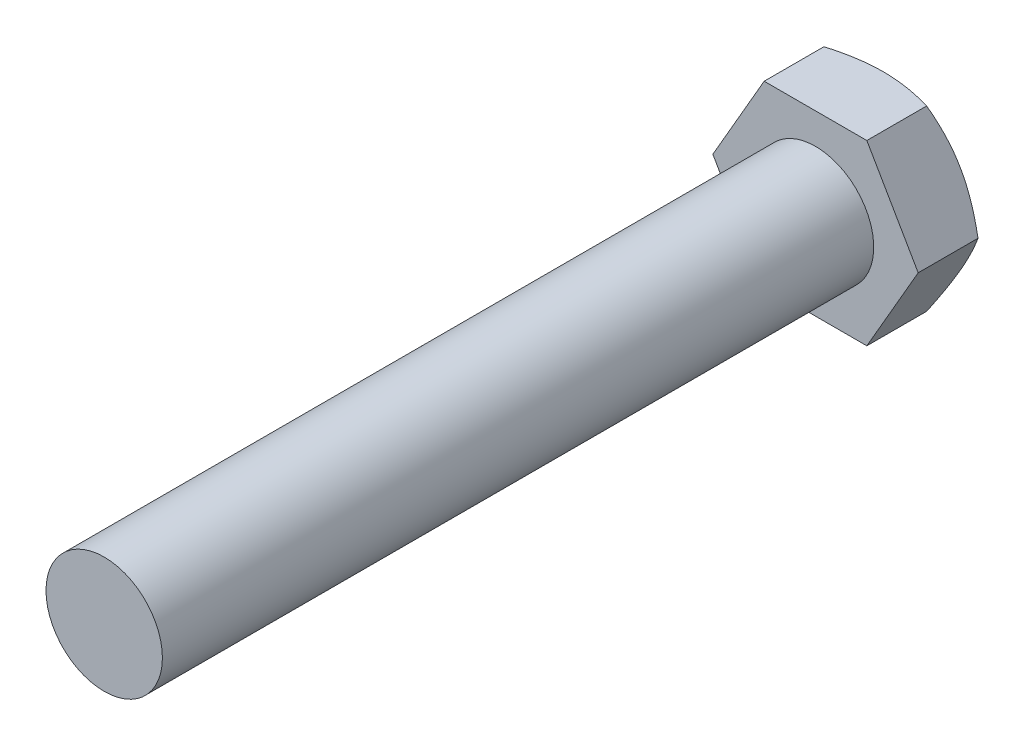
ISO-10303-21;
HEADER;
FILE_DESCRIPTION(('STEP AP214'),'2;1');
FILE_NAME('part.step','',(''),(''),'','','');
FILE_SCHEMA(('AUTOMOTIVE_DESIGN { 1 0 10303 214 1 1 1 1 }'));
ENDSEC;
DATA;
#1=APPLICATION_CONTEXT('core data for automotive mechanical design processes');
#2=APPLICATION_PROTOCOL_DEFINITION('international standard','automotive_design',2000,#1);
#3=PRODUCT_CONTEXT('',#1,'mechanical');
#4=PRODUCT('Part','Part','',(#3));
#5=PRODUCT_RELATED_PRODUCT_CATEGORY('part','',(#4));
#6=PRODUCT_DEFINITION_FORMATION('','',#4);
#7=PRODUCT_DEFINITION_CONTEXT('part definition',#1,'design');
#8=PRODUCT_DEFINITION('design','',#6,#7);
#9=PRODUCT_DEFINITION_SHAPE('','',#8);
#10=(LENGTH_UNIT() NAMED_UNIT(*) SI_UNIT(.MILLI.,.METRE.));
#11=(NAMED_UNIT(*) PLANE_ANGLE_UNIT() SI_UNIT($,.RADIAN.));
#12=(NAMED_UNIT(*) SI_UNIT($,.STERADIAN.) SOLID_ANGLE_UNIT());
#13=UNCERTAINTY_MEASURE_WITH_UNIT(LENGTH_MEASURE(1.E-05),#10,'distance_accuracy_value','');
#14=(GEOMETRIC_REPRESENTATION_CONTEXT(3) GLOBAL_UNCERTAINTY_ASSIGNED_CONTEXT((#13)) GLOBAL_UNIT_ASSIGNED_CONTEXT((#10,
#11,#12)) REPRESENTATION_CONTEXT('',''));
#15=CARTESIAN_POINT('',(0.,0.,0.));
#16=DIRECTION('',(0.,0.,1.));
#17=DIRECTION('',(1.,0.,0.));
#18=AXIS2_PLACEMENT_3D('',#15,#16,#17);
#19=CARTESIAN_POINT('',(15.8771324027147,-27.5,22.5));
#20=DIRECTION('',(-0.866025403784439,0.499999999999999,0.));
#21=DIRECTION('',(-0.499999999999999,-0.866025403784439,0.));
#22=AXIS2_PLACEMENT_3D('',#19,#20,#21);
#23=PLANE('',#22);
#24=CARTESIAN_POINT('',(31.7543802754832,0.000200000000020599,4.0000666670303));
#25=CARTESIAN_POINT('',(31.4054079553827,-0.604237788849367,3.79860242506893));
#26=CARTESIAN_POINT('',(31.0550744575328,-1.2110332067186,3.60628041248676));
#27=CARTESIAN_POINT('',(30.3515982095276,-2.42948981018162,3.2424620439205));
#28=CARTESIAN_POINT('',(29.9984545758749,-3.04115252603762,3.0709725374349));
#29=CARTESIAN_POINT('',(29.288668030154,-4.27053888575502,2.75112097915205));
#30=CARTESIAN_POINT('',(28.9320188501902,-4.8882733859301,2.60281415665775));
#31=CARTESIAN_POINT('',(28.2162574458172,-6.12800850440099,2.33252283850918));
#32=CARTESIAN_POINT('',(27.8571454704538,-6.75000869133673,2.21053572066545));
#33=CARTESIAN_POINT('',(27.1456376531005,-7.98237638097519,1.99806197872558));
#34=CARTESIAN_POINT('',(26.7932945869289,-8.59265247327894,1.90687270210693));
#35=CARTESIAN_POINT('',(26.0869940021723,-9.816000971493,1.75396926252744));
#36=CARTESIAN_POINT('',(25.7330364526428,-10.4290734310007,1.6922556669379));
#37=CARTESIAN_POINT('',(25.0245267818511,-11.6562481784659,1.59986182625366));
#38=CARTESIAN_POINT('',(24.66997587095,-12.2703483700163,1.56914470488069));
#39=CARTESIAN_POINT('',(23.960546874664,-13.4991154359462,1.53940437569927));
#40=CARTESIAN_POINT('',(23.6056687997282,-14.1137822922274,1.54038018849997));
#41=CARTESIAN_POINT('',(22.9422198524702,-15.2629095771062,1.57181198485078));
#42=CARTESIAN_POINT('',(22.6336017259233,-15.7974518524223,1.59843513827466));
#43=CARTESIAN_POINT('',(22.0171022601112,-16.8652602500478,1.67514515891808));
#44=CARTESIAN_POINT('',(21.7092209103562,-17.3985263905264,1.72523169005251));
#45=CARTESIAN_POINT('',(21.0943087503184,-18.4635854939038,1.84800042236974));
#46=CARTESIAN_POINT('',(20.787278963453,-18.9953766841916,1.92070305585215));
#47=CARTESIAN_POINT('',(20.1746894958628,-20.0564127662394,2.08741729206136));
#48=CARTESIAN_POINT('',(19.8691298089152,-20.5856576687775,2.18142880450927));
#49=CARTESIAN_POINT('',(18.9415157523796,-22.1923323445123,2.4978393092325));
#50=CARTESIAN_POINT('',(18.3220968849487,-23.2651972940694,2.75180503572449));
#51=CARTESIAN_POINT('',(17.3998090934324,-24.8626466081761,3.18416962621694));
#52=CARTESIAN_POINT('',(17.0937841912214,-25.3926972871869,3.33670490708896));
#53=CARTESIAN_POINT('',(16.4838511067447,-26.4491323787176,3.65721775994826));
#54=CARTESIAN_POINT('',(16.1799423537135,-26.9755177798326,3.82519097955909));
#55=CARTESIAN_POINT('',(15.8770169326609,-27.5002,4.00006666703032));
#56=B_SPLINE_CURVE_WITH_KNOTS('',3,(#24,#25,#26,#27,#28,#29,#30,#31,#32,#33,#34,#35,#36,#37,#38,
#39,#40,#41,#42,#43,#44,#45,#46,#47,#48,#49,#50,#51,#52,#53,#54,#55),.UNSPECIFIED.,.F.,.F.,(4,2,
2,2,2,2,2,2,2,2,2,2,2,2,2,4),(0.,2.17937596004525,4.35946654657183,6.54467421858153,
8.72966408126494,10.8607692974364,12.9919155331585,15.120523359995,17.2490654075945,
19.1020483557859,20.9550047630006,22.8096400916025,24.6642675628548,28.4552152198911,
30.3473870339695,32.2390270200263),.UNSPECIFIED.);
#57=CARTESIAN_POINT('',(31.7542648054294,0.,4.));
#58=VERTEX_POINT('',#57);
#59=CARTESIAN_POINT('',(15.8771324027147,-27.5,4.00000000000001));
#60=VERTEX_POINT('',#59);
#61=EDGE_CURVE('E50',#58,#60,#56,.T.);
#62=ORIENTED_EDGE('',*,*,#61,.F.);
#63=DIRECTION('',(0.,0.,-1.));
#64=VECTOR('',#63,1.);
#65=CARTESIAN_POINT('',(31.7542648054294,0.,22.5));
#66=LINE('',#65,#64);
#67=CARTESIAN_POINT('',(31.7542648054294,0.,22.5));
#68=VERTEX_POINT('',#67);
#69=EDGE_CURVE('E43',#68,#58,#66,.T.);
#70=ORIENTED_EDGE('',*,*,#69,.F.);
#71=DIRECTION('',(0.499999999999999,0.866025403784439,0.));
#72=VECTOR('',#71,1.);
#73=CARTESIAN_POINT('',(15.8771324027147,-27.5,22.5));
#74=LINE('',#73,#72);
#75=CARTESIAN_POINT('',(15.8771324027147,-27.5,22.5));
#76=VERTEX_POINT('',#75);
#77=EDGE_CURVE('E132',#76,#68,#74,.T.);
#78=ORIENTED_EDGE('',*,*,#77,.F.);
#79=DIRECTION('',(0.,0.,-1.));
#80=VECTOR('',#79,1.);
#81=CARTESIAN_POINT('',(15.8771324027147,-27.5,22.5));
#82=LINE('',#81,#80);
#83=EDGE_CURVE('E115',#76,#60,#82,.T.);
#84=ORIENTED_EDGE('',*,*,#83,.T.);
#85=EDGE_LOOP('',(#62,#70,#78,#84));
#86=FACE_BOUND('',#85,.T.);
#87=ADVANCED_FACE('F34',(#86),#23,.F.);
#88=CARTESIAN_POINT('',(31.7542648054294,0.,22.5));
#89=DIRECTION('',(-0.866025403784438,-0.5,0.));
#90=DIRECTION('',(0.5,-0.866025403784439,0.));
#91=AXIS2_PLACEMENT_3D('',#88,#89,#90);
#92=PLANE('',#91);
#93=CARTESIAN_POINT('',(15.8770169326608,27.5002,4.00006666703032));
#94=CARTESIAN_POINT('',(16.2259892527614,26.8957622111507,3.79860242506895));
#95=CARTESIAN_POINT('',(16.5763227506112,26.2889667932814,3.60628041248678));
#96=CARTESIAN_POINT('',(17.2797989986165,25.0705101898184,3.24246204392052));
#97=CARTESIAN_POINT('',(17.6329426322692,24.4588474739624,3.07097253743491));
#98=CARTESIAN_POINT('',(18.3427291779901,23.229461114245,2.75112097915206));
#99=CARTESIAN_POINT('',(18.6993783579539,22.6117266140699,2.60281415665776));
#100=CARTESIAN_POINT('',(19.4151397623269,21.371991495599,2.33252283850919));
#101=CARTESIAN_POINT('',(19.7742517376903,20.7499913086633,2.21053572066546));
#102=CARTESIAN_POINT('',(20.4857595550436,19.5176236190248,1.99806197872559));
#103=CARTESIAN_POINT('',(20.8381026212152,18.9073475267211,1.90687270210694));
#104=CARTESIAN_POINT('',(21.5444032059718,17.683999028507,1.75396926252745));
#105=CARTESIAN_POINT('',(21.8983607555013,17.0709265689993,1.6922556669379));
#106=CARTESIAN_POINT('',(22.6068704262931,15.8437518215341,1.59986182625366));
#107=CARTESIAN_POINT('',(22.9614213371941,15.2296516299837,1.5691447048807));
#108=CARTESIAN_POINT('',(23.6708503334801,14.0008845640538,1.53940437569928));
#109=CARTESIAN_POINT('',(24.0257284084159,13.3862177077726,1.54038018849997));
#110=CARTESIAN_POINT('',(24.6891773556739,12.2370904228938,1.57181198485078));
#111=CARTESIAN_POINT('',(24.9977954822209,11.7025481475777,1.59843513827466));
#112=CARTESIAN_POINT('',(25.6142949480329,10.6347397499522,1.67514515891808));
#113=CARTESIAN_POINT('',(25.9221762977879,10.1014736094737,1.7252316900525));
#114=CARTESIAN_POINT('',(26.5370884578257,9.03641450609625,1.84800042236973));
#115=CARTESIAN_POINT('',(26.8441182446911,8.50462331580842,1.92070305585214));
#116=CARTESIAN_POINT('',(27.4567077122813,7.44358723376061,2.08741729206136));
#117=CARTESIAN_POINT('',(27.7622673992289,6.91434233122253,2.18142880450926));
#118=CARTESIAN_POINT('',(28.6898814557645,5.30766765548772,2.49783930923249));
#119=CARTESIAN_POINT('',(29.3093003231954,4.23480270593067,2.75180503572448));
#120=CARTESIAN_POINT('',(30.2315881147117,2.63735339182395,3.18416962621692));
#121=CARTESIAN_POINT('',(30.5376130169227,2.10730271281318,3.33670490708894));
#122=CARTESIAN_POINT('',(31.1475461013994,1.05086762128241,3.65721775994824));
#123=CARTESIAN_POINT('',(31.4514548544306,0.524482220167445,3.82519097955907));
#124=CARTESIAN_POINT('',(31.7543802754832,-0.000199999999977154,4.0000666670303));
#125=B_SPLINE_CURVE_WITH_KNOTS('',3,(#93,#94,#95,#96,#97,#98,#99,#100,#101,#102,#103,#104,#105,
#106,#107,#108,#109,#110,#111,#112,#113,#114,#115,#116,#117,#118,#119,#120,#121,#122,#123,#124),
.UNSPECIFIED.,.F.,.F.,(4,2,2,2,2,2,2,2,2,2,2,2,2,2,2,4),(0.,2.17937596004525,4.35946654657184,
6.54467421858153,8.72966408126495,10.8607692974364,12.9919155331585,15.120523359995,
17.2490654075945,19.1020483557859,20.9550047630006,22.8096400916025,24.6642675628548,
28.4552152198911,30.3473870339695,32.2390270200263),.UNSPECIFIED.);
#126=CARTESIAN_POINT('',(15.8771324027146,27.5,4.));
#127=VERTEX_POINT('',#126);
#128=EDGE_CURVE('E127',#127,#58,#125,.T.);
#129=ORIENTED_EDGE('',*,*,#128,.F.);
#130=DIRECTION('',(0.,0.,-1.));
#131=VECTOR('',#130,1.);
#132=CARTESIAN_POINT('',(15.8771324027147,27.5,22.5));
#133=LINE('',#132,#131);
#134=CARTESIAN_POINT('',(15.8771324027147,27.5,22.5));
#135=VERTEX_POINT('',#134);
#136=EDGE_CURVE('E113',#135,#127,#133,.T.);
#137=ORIENTED_EDGE('',*,*,#136,.F.);
#138=DIRECTION('',(-0.5,0.866025403784439,0.));
#139=VECTOR('',#138,1.);
#140=CARTESIAN_POINT('',(31.7542648054294,0.,22.5));
#141=LINE('',#140,#139);
#142=EDGE_CURVE('E128',#68,#135,#141,.T.);
#143=ORIENTED_EDGE('',*,*,#142,.F.);
#144=ORIENTED_EDGE('',*,*,#69,.T.);
#145=EDGE_LOOP('',(#129,#137,#143,#144));
#146=FACE_BOUND('',#145,.T.);
#147=ADVANCED_FACE('F125',(#146),#92,.F.);
#148=CARTESIAN_POINT('',(15.8771324027147,27.5,22.5));
#149=DIRECTION('',(0.,-1.,0.));
#150=DIRECTION('',(0.,0.,-1.));
#151=AXIS2_PLACEMENT_3D('',#148,#149,#150);
#152=PLANE('',#151);
#153=CARTESIAN_POINT('',(-41.8947454678367,27.5,14.6000366617364));
#154=CARTESIAN_POINT('',(-41.2972373909664,27.5,14.3116534517566));
#155=CARTESIAN_POINT('',(-40.6990068929886,27.5,14.0247623738565));
#156=CARTESIAN_POINT('',(-39.5009511300616,27.5,13.4543136502321));
#157=CARTESIAN_POINT('',(-38.9011258479096,27.5,13.1707560406461));
#158=CARTESIAN_POINT('',(-37.699644265307,27.5,12.6072831310829));
#159=CARTESIAN_POINT('',(-37.0979876786622,27.5,12.3273684407369));
#160=CARTESIAN_POINT('',(-35.89278188998,27.5,11.7716495819909));
#161=CARTESIAN_POINT('',(-35.2892326926426,27.5,11.4958454033926));
#162=CARTESIAN_POINT('',(-33.4685027344424,27.5,10.6721240752369));
#163=CARTESIAN_POINT('',(-32.2481635726962,27.5,10.1311578779397));
#164=CARTESIAN_POINT('',(-29.7975060167707,27.5,9.07236490833983));
#165=CARTESIAN_POINT('',(-28.5671881213292,27.5,8.5545369879024));
#166=CARTESIAN_POINT('',(-26.6944828297253,27.5,7.79238620628076));
#167=CARTESIAN_POINT('',(-26.0564838638613,27.5,7.53726979622735));
#168=CARTESIAN_POINT('',(-24.7770243788651,27.5,7.03588145327266));
#169=CARTESIAN_POINT('',(-24.1355639157578,27.5,6.78960937771542));
#170=CARTESIAN_POINT('',(-22.8487781022656,27.5,6.30705873165255));
#171=CARTESIAN_POINT('',(-22.2034521877735,27.5,6.07078166244337));
#172=CARTESIAN_POINT('',(-20.9087477586919,27.5,5.60963658923502));
#173=CARTESIAN_POINT('',(-20.259369341555,27.5,5.38476831206087));
#174=CARTESIAN_POINT('',(-18.957662124008,27.5,4.94846055805872));
#175=CARTESIAN_POINT('',(-18.3053427862327,27.5,4.73699299433837));
#176=CARTESIAN_POINT('',(-16.9961481428003,27.5,4.32871044661214));
#177=CARTESIAN_POINT('',(-16.3392727572,27.5,4.13189572042883));
#178=CARTESIAN_POINT('',(-14.361833697016,27.5,3.56639269386105));
#179=CARTESIAN_POINT('',(-13.0339381127029,27.5,3.22246847936505));
#180=CARTESIAN_POINT('',(-11.031434756771,27.5,2.76996204973807));
#181=CARTESIAN_POINT('',(-10.3638442239196,27.5,2.62996226799986));
#182=CARTESIAN_POINT('',(-9.02424446808465,27.5,2.37283291197604));
#183=CARTESIAN_POINT('',(-8.35223534476823,27.5,2.25570282365143));
#184=CARTESIAN_POINT('',(-7.00433323602539,27.5,2.04642483892905));
#185=CARTESIAN_POINT('',(-6.32844032392663,27.5,1.9542764724376));
#186=CARTESIAN_POINT('',(-4.97351254051254,27.5,1.79682019393032));
#187=CARTESIAN_POINT('',(-4.29447766919676,27.5,1.7315122819184));
#188=CARTESIAN_POINT('',(-2.94278198682926,27.5,1.62981846339275));
#189=CARTESIAN_POINT('',(-2.27014780593405,27.5,1.59308070477981));
#190=CARTESIAN_POINT('',(-0.923932546833282,27.5,1.5480197580831));
#191=CARTESIAN_POINT('',(-0.25035148371753,27.5,1.53969612220567));
#192=CARTESIAN_POINT('',(1.09656967846981,27.5,1.55166026690575));
#193=CARTESIAN_POINT('',(1.76990977333864,27.5,1.57194852429792));
#194=CARTESIAN_POINT('',(3.11515843216523,27.5,1.64065650370872));
#195=CARTESIAN_POINT('',(3.7870669298189,27.5,1.68907750143555));
#196=CARTESIAN_POINT('',(5.42532233336096,27.5,1.84043981947153));
#197=CARTESIAN_POINT('',(6.39033802104639,27.5,1.95802743528604));
#198=CARTESIAN_POINT('',(8.31270703745943,27.5,2.24464081506791));
#199=CARTESIAN_POINT('',(9.27005920453824,27.5,2.41367423122313));
#200=CARTESIAN_POINT('',(11.1763609746558,27.5,2.79716440636785));
#201=CARTESIAN_POINT('',(12.1253029502191,27.5,3.01165872239533));
#202=CARTESIAN_POINT('',(14.0134303866352,27.5,3.47957263526606));
#203=CARTESIAN_POINT('',(14.9526160440282,27.5,3.73299144634877));
#204=CARTESIAN_POINT('',(16.8415518462086,27.5,4.27853159327818));
#205=CARTESIAN_POINT('',(17.7910937558704,27.5,4.57136903835438));
#206=CARTESIAN_POINT('',(19.6808199103929,27.5,5.18567361532169));
#207=CARTESIAN_POINT('',(20.6210040951731,27.5,5.50714093089687));
#208=CARTESIAN_POINT('',(22.4925084364906,27.5,6.17374483703705));
#209=CARTESIAN_POINT('',(23.4238317765158,27.5,6.51887253076576));
#210=CARTESIAN_POINT('',(25.2788712866894,27.5,7.22889736074903));
#211=CARTESIAN_POINT('',(26.2025875272759,27.5,7.59379431371175));
#212=CARTESIAN_POINT('',(28.3000238208811,27.5,8.4441283279179));
#213=CARTESIAN_POINT('',(29.471617813136,27.5,8.93480023200268));
#214=CARTESIAN_POINT('',(31.8055987556466,27.5,9.93763024061148));
#215=CARTESIAN_POINT('',(32.9679852561527,27.5,10.4497893871019));
#216=CARTESIAN_POINT('',(35.2851719751703,27.5,11.4914928346583));
#217=CARTESIAN_POINT('',(36.439970806082,27.5,12.0210402149413));
#218=CARTESIAN_POINT('',(38.7429827226564,27.5,13.0941875355533));
#219=CARTESIAN_POINT('',(39.8911959173483,27.5,13.6377872424121));
#220=CARTESIAN_POINT('',(42.1831397378352,27.5,14.7370414347066));
#221=CARTESIAN_POINT('',(43.3268652133735,27.5,15.292706641526));
#222=CARTESIAN_POINT('',(45.6096076210854,27.5,16.4136234156036));
#223=CARTESIAN_POINT('',(46.7486245374792,27.5,16.9788750149565));
#224=CARTESIAN_POINT('',(49.0225272272282,27.5,18.1173354761568));
#225=CARTESIAN_POINT('',(50.1574134050977,27.5,18.6905435308553));
#226=CARTESIAN_POINT('',(52.4237428699915,27.5,19.8437164397739));
#227=CARTESIAN_POINT('',(53.555186162129,27.5,20.4236812839531));
#228=CARTESIAN_POINT('',(55.7274104822851,27.5,21.5441204259652));
#229=CARTESIAN_POINT('',(56.7684126856516,27.5,22.0841662241523));
#230=CARTESIAN_POINT('',(58.8482068048337,27.5,23.1684985960759));
#231=CARTESIAN_POINT('',(59.8869987172166,27.5,23.7127851763925));
#232=CARTESIAN_POINT('',(63.0005247138021,27.5,25.3511917747704));
#233=CARTESIAN_POINT('',(65.072355804398,27.5,26.4508311076314));
#234=CARTESIAN_POINT('',(68.1733327696841,27.5,28.1076119477958));
#235=CARTESIAN_POINT('',(69.2047598542921,27.5,28.6604950978634));
#236=CARTESIAN_POINT('',(71.2662623123326,27.5,29.7687778050728));
#237=CARTESIAN_POINT('',(72.2963376853073,27.5,30.3241773630661));
#238=CARTESIAN_POINT('',(74.3552332450533,27.5,31.4371812281622));
#239=CARTESIAN_POINT('',(75.3840534887652,27.5,31.9947854299818));
#240=CARTESIAN_POINT('',(77.4406063539137,27.5,33.1119923604191));
#241=CARTESIAN_POINT('',(78.4683389770089,27.5,33.6715950859835));
#242=CARTESIAN_POINT('',(79.4955887943185,27.5,34.2320817881131));
#243=B_SPLINE_CURVE_WITH_KNOTS('',3,(#153,#154,#155,#156,#157,#158,#159,#160,#161,#162,#163,
#164,#165,#166,#167,#168,#169,#170,#171,#172,#173,#174,#175,#176,#177,#178,#179,#180,#181,#182,
#183,#184,#185,#186,#187,#188,#189,#190,#191,#192,#193,#194,#195,#196,#197,#198,#199,#200,#201,
#202,#203,#204,#205,#206,#207,#208,#209,#210,#211,#212,#213,#214,#215,#216,#217,#218,#219,#220,
#221,#222,#223,#224,#225,#226,#227,#228,#229,#230,#231,#232,#233,#234,#235,#236,#237,#238,#239,
#240,#241,#242),.UNSPECIFIED.,.F.,.F.,(4,2,2,2,2,2,2,2,2,2,2,2,2,2,2,2,2,2,2,2,2,2,2,2,2,2,2,2,
2,2,2,2,2,2,2,2,2,2,2,2,2,2,2,2,4),(0.,1.99038444929256,3.98079045650996,5.97152537634551,
7.96225535635476,11.9666718953306,15.9708895116644,18.0321811133202,20.0934394521326,
22.1550063100821,24.2165237820355,26.2735668873462,28.3306461786083,32.443161073089,
34.4891829306632,36.5351587947861,38.5810961560741,40.6270335176603,42.6473568208032,
44.6676482844216,46.6879734164152,48.7083901692911,51.6232202935197,54.53848418955,
57.4561659535506,60.3737888266659,63.3542610743566,66.3347524455965,69.3141291676777,
72.2934782710206,76.1037752784246,79.914257270044,83.7254177238482,87.5365148983342,
91.3511496986099,95.1657972725792,98.9800606545813,102.794318369202,106.312547641374,
109.830782373659,116.867431695817,120.378226684208,123.88902286096,127.399653356416,
130.910278490591),.UNSPECIFIED.);
#244=CARTESIAN_POINT('',(-15.8771324027148,27.4999999999999,4.));
#245=VERTEX_POINT('',#244);
#246=EDGE_CURVE('E107',#245,#127,#243,.T.);
#247=ORIENTED_EDGE('',*,*,#246,.F.);
#248=DIRECTION('',(0.,0.,-1.));
#249=VECTOR('',#248,1.);
#250=CARTESIAN_POINT('',(-15.8771324027147,27.5,22.5));
#251=LINE('',#250,#249);
#252=CARTESIAN_POINT('',(-15.8771324027147,27.5,22.5));
#253=VERTEX_POINT('',#252);
#254=EDGE_CURVE('E106',#253,#245,#251,.T.);
#255=ORIENTED_EDGE('',*,*,#254,.F.);
#256=DIRECTION('',(-1.,0.,0.));
#257=VECTOR('',#256,1.);
#258=CARTESIAN_POINT('',(15.8771324027147,27.5,22.5));
#259=LINE('',#258,#257);
#260=EDGE_CURVE('E277',#135,#253,#259,.T.);
#261=ORIENTED_EDGE('',*,*,#260,.F.);
#262=ORIENTED_EDGE('',*,*,#136,.T.);
#263=EDGE_LOOP('',(#247,#255,#261,#262));
#264=FACE_BOUND('',#263,.T.);
#265=ADVANCED_FACE('F182',(#264),#152,.F.);
#266=CARTESIAN_POINT('',(-15.8771324027147,27.5,22.5));
#267=DIRECTION('',(0.866025403784439,-0.5,0.));
#268=DIRECTION('',(0.5,0.866025403784439,0.));
#269=AXIS2_PLACEMENT_3D('',#266,#267,#268);
#270=PLANE('',#269);
#271=CARTESIAN_POINT('',(-31.7543802754833,-0.000200000000000103,4.00006666703033));
#272=CARTESIAN_POINT('',(-31.4054079553827,0.604237788849389,3.79860242506896));
#273=CARTESIAN_POINT('',(-31.0550744575329,1.21103320671862,3.60628041248679));
#274=CARTESIAN_POINT('',(-30.3515982095276,2.42948981018164,3.24246204392053));
#275=CARTESIAN_POINT('',(-29.9984545758749,3.04115252603765,3.07097253743493));
#276=CARTESIAN_POINT('',(-29.288668030154,4.27053888575504,2.75112097915208));
#277=CARTESIAN_POINT('',(-28.9320188501902,4.88827338593012,2.60281415665777));
#278=CARTESIAN_POINT('',(-28.2162574458172,6.12800850440102,2.3325228385092));
#279=CARTESIAN_POINT('',(-27.8571454704539,6.75000869133676,2.21053572066547));
#280=CARTESIAN_POINT('',(-27.1456376531005,7.98237638097522,1.99806197872561));
#281=CARTESIAN_POINT('',(-26.7932945869289,8.59265247327897,1.90687270210695));
#282=CARTESIAN_POINT('',(-26.0869940021723,9.81600097149304,1.75396926252746));
#283=CARTESIAN_POINT('',(-25.7330364526428,10.4290734310008,1.69225566693792));
#284=CARTESIAN_POINT('',(-25.0245267818511,11.6562481784659,1.59986182625368));
#285=CARTESIAN_POINT('',(-24.66997587095,12.2703483700163,1.56914470488071));
#286=CARTESIAN_POINT('',(-23.9605468746641,13.4991154359462,1.53940437569929));
#287=CARTESIAN_POINT('',(-23.6056687997282,14.1137822922274,1.5403801885));
#288=CARTESIAN_POINT('',(-22.9422198524703,15.2629095771062,1.57181198485081));
#289=CARTESIAN_POINT('',(-22.6336017259233,15.7974518524223,1.59843513827468));
#290=CARTESIAN_POINT('',(-22.0171022601112,16.8652602500478,1.67514515891811));
#291=CARTESIAN_POINT('',(-21.7092209103562,17.3985263905264,1.72523169005253));
#292=CARTESIAN_POINT('',(-21.0943087503184,18.4635854939038,1.84800042236976));
#293=CARTESIAN_POINT('',(-20.7872789634531,18.9953766841916,1.92070305585217));
#294=CARTESIAN_POINT('',(-20.1746894958629,20.0564127662395,2.08741729206139));
#295=CARTESIAN_POINT('',(-19.8691298089153,20.5856576687775,2.18142880450929));
#296=CARTESIAN_POINT('',(-18.9415157523796,22.1923323445123,2.49783930923252));
#297=CARTESIAN_POINT('',(-18.3220968849487,23.2651972940694,2.7518050357245));
#298=CARTESIAN_POINT('',(-17.3998090934324,24.8626466081761,3.18416962621695));
#299=CARTESIAN_POINT('',(-17.0937841912214,25.3926972871869,3.33670490708897));
#300=CARTESIAN_POINT('',(-16.4838511067448,26.4491323787177,3.65721775994828));
#301=CARTESIAN_POINT('',(-16.1799423537136,26.9755177798326,3.82519097955911));
#302=CARTESIAN_POINT('',(-15.8770169326609,27.5002,4.00006666703033));
#303=B_SPLINE_CURVE_WITH_KNOTS('',3,(#271,#272,#273,#274,#275,#276,#277,#278,#279,#280,#281,
#282,#283,#284,#285,#286,#287,#288,#289,#290,#291,#292,#293,#294,#295,#296,#297,#298,#299,#300,
#301,#302),.UNSPECIFIED.,.F.,.F.,(4,2,2,2,2,2,2,2,2,2,2,2,2,2,2,4),(0.,2.17937596004525,
4.35946654657184,6.54467421858154,8.72966408126495,10.8607692974364,12.9919155331585,
15.120523359995,17.2490654075945,19.1020483557859,20.9550047630006,22.8096400916025,
24.6642675628548,28.4552152198911,30.3473870339695,32.2390270200263),.UNSPECIFIED.);
#304=CARTESIAN_POINT('',(-31.7542648054294,0.,4.));
#305=VERTEX_POINT('',#304);
#306=EDGE_CURVE('E90',#305,#245,#303,.T.);
#307=ORIENTED_EDGE('',*,*,#306,.F.);
#308=DIRECTION('',(0.,0.,-1.));
#309=VECTOR('',#308,1.);
#310=CARTESIAN_POINT('',(-31.7542648054295,0.,22.5));
#311=LINE('',#310,#309);
#312=CARTESIAN_POINT('',(-31.7542648054295,0.,22.5));
#313=VERTEX_POINT('',#312);
#314=EDGE_CURVE('E103',#313,#305,#311,.T.);
#315=ORIENTED_EDGE('',*,*,#314,.F.);
#316=DIRECTION('',(-0.5,-0.866025403784439,0.));
#317=VECTOR('',#316,1.);
#318=CARTESIAN_POINT('',(-15.8771324027147,27.5,22.5));
#319=LINE('',#318,#317);
#320=EDGE_CURVE('E281',#253,#313,#319,.T.);
#321=ORIENTED_EDGE('',*,*,#320,.F.);
#322=ORIENTED_EDGE('',*,*,#254,.T.);
#323=EDGE_LOOP('',(#307,#315,#321,#322));
#324=FACE_BOUND('',#323,.T.);
#325=ADVANCED_FACE('F101',(#324),#270,.F.);
#326=CARTESIAN_POINT('',(-31.7542648054295,0.,22.5));
#327=DIRECTION('',(0.866025403784439,0.5,0.));
#328=DIRECTION('',(-0.5,0.866025403784439,0.));
#329=AXIS2_PLACEMENT_3D('',#326,#327,#328);
#330=PLANE('',#329);
#331=CARTESIAN_POINT('',(-15.8770169326609,-27.5002,4.00006666703033));
#332=CARTESIAN_POINT('',(-16.2259892527615,-26.8957622111506,3.79860242506896));
#333=CARTESIAN_POINT('',(-16.5763227506113,-26.2889667932814,3.60628041248679));
#334=CARTESIAN_POINT('',(-17.2797989986166,-25.0705101898184,3.24246204392053));
#335=CARTESIAN_POINT('',(-17.6329426322693,-24.4588474739624,3.07097253743493));
#336=CARTESIAN_POINT('',(-18.3427291779902,-23.229461114245,2.75112097915208));
#337=CARTESIAN_POINT('',(-18.699378357954,-22.6117266140699,2.60281415665777));
#338=CARTESIAN_POINT('',(-19.415139762327,-21.371991495599,2.3325228385092));
#339=CARTESIAN_POINT('',(-19.7742517376903,-20.7499913086633,2.21053572066547));
#340=CARTESIAN_POINT('',(-20.4857595550437,-19.5176236190248,1.9980619787256));
#341=CARTESIAN_POINT('',(-20.8381026212152,-18.9073475267211,1.90687270210695));
#342=CARTESIAN_POINT('',(-21.5444032059719,-17.683999028507,1.75396926252746));
#343=CARTESIAN_POINT('',(-21.8983607555014,-17.0709265689993,1.69225566693792));
#344=CARTESIAN_POINT('',(-22.6068704262931,-15.8437518215341,1.59986182625368));
#345=CARTESIAN_POINT('',(-22.9614213371941,-15.2296516299837,1.56914470488072));
#346=CARTESIAN_POINT('',(-23.6708503334801,-14.0008845640538,1.5394043756993));
#347=CARTESIAN_POINT('',(-24.025728408416,-13.3862177077726,1.5403801885));
#348=CARTESIAN_POINT('',(-24.6891773556739,-12.2370904228938,1.57181198485081));
#349=CARTESIAN_POINT('',(-24.9977954822209,-11.7025481475777,1.59843513827468));
#350=CARTESIAN_POINT('',(-25.6142949480329,-10.6347397499522,1.6751451589181));
#351=CARTESIAN_POINT('',(-25.9221762977879,-10.1014736094736,1.72523169005253));
#352=CARTESIAN_POINT('',(-26.5370884578258,-9.03641450609622,1.84800042236976));
#353=CARTESIAN_POINT('',(-26.8441182446911,-8.50462331580839,1.92070305585217));
#354=CARTESIAN_POINT('',(-27.4567077122813,-7.44358723376058,2.08741729206139));
#355=CARTESIAN_POINT('',(-27.7622673992289,-6.9143423312225,2.18142880450929));
#356=CARTESIAN_POINT('',(-28.6898814557646,-5.3076676554877,2.49783930923252));
#357=CARTESIAN_POINT('',(-29.3093003231954,-4.23480270593065,2.7518050357245));
#358=CARTESIAN_POINT('',(-30.2315881147117,-2.63735339182392,3.18416962621695));
#359=CARTESIAN_POINT('',(-30.5376130169228,-2.10730271281316,3.33670490708897));
#360=CARTESIAN_POINT('',(-31.1475461013994,-1.05086762128238,3.65721775994827));
#361=CARTESIAN_POINT('',(-31.4514548544306,-0.524482220167421,3.82519097955911));
#362=CARTESIAN_POINT('',(-31.7543802754833,0.000199999999999268,4.00006666703033));
#363=B_SPLINE_CURVE_WITH_KNOTS('',3,(#331,#332,#333,#334,#335,#336,#337,#338,#339,#340,#341,
#342,#343,#344,#345,#346,#347,#348,#349,#350,#351,#352,#353,#354,#355,#356,#357,#358,#359,#360,
#361,#362),.UNSPECIFIED.,.F.,.F.,(4,2,2,2,2,2,2,2,2,2,2,2,2,2,2,4),(0.,2.17937596004525,
4.35946654657184,6.54467421858154,8.72966408126496,10.8607692974364,12.9919155331585,
15.120523359995,17.2490654075945,19.1020483557859,20.9550047630006,22.8096400916025,
24.6642675628548,28.4552152198911,30.3473870339695,32.2390270200263),.UNSPECIFIED.);
#364=CARTESIAN_POINT('',(-15.8771324027146,-27.5,4.));
#365=VERTEX_POINT('',#364);
#366=EDGE_CURVE('E87',#365,#305,#363,.T.);
#367=ORIENTED_EDGE('',*,*,#366,.F.);
#368=DIRECTION('',(0.,0.,-1.));
#369=VECTOR('',#368,1.);
#370=CARTESIAN_POINT('',(-15.8771324027147,-27.5,22.5));
#371=LINE('',#370,#369);
#372=CARTESIAN_POINT('',(-15.8771324027147,-27.5,22.5));
#373=VERTEX_POINT('',#372);
#374=EDGE_CURVE('E111',#373,#365,#371,.T.);
#375=ORIENTED_EDGE('',*,*,#374,.F.);
#376=DIRECTION('',(0.5,-0.866025403784439,0.));
#377=VECTOR('',#376,1.);
#378=CARTESIAN_POINT('',(-31.7542648054295,0.,22.5));
#379=LINE('',#378,#377);
#380=EDGE_CURVE('E110',#313,#373,#379,.T.);
#381=ORIENTED_EDGE('',*,*,#380,.F.);
#382=ORIENTED_EDGE('',*,*,#314,.T.);
#383=EDGE_LOOP('',(#367,#375,#381,#382));
#384=FACE_BOUND('',#383,.T.);
#385=ADVANCED_FACE('F109',(#384),#330,.F.);
#386=CARTESIAN_POINT('',(-15.8771324027147,-27.5,22.5));
#387=DIRECTION('',(0.,1.,0.));
#388=DIRECTION('',(-1.,0.,0.));
#389=AXIS2_PLACEMENT_3D('',#386,#387,#388);
#390=PLANE('',#389);
#391=CARTESIAN_POINT('',(-41.8947454678366,-27.5,14.6000366617364));
#392=CARTESIAN_POINT('',(-41.2972373909664,-27.5,14.3116534517566));
#393=CARTESIAN_POINT('',(-40.6990068929886,-27.5,14.0247623738565));
#394=CARTESIAN_POINT('',(-39.5009511300616,-27.5,13.4543136502321));
#395=CARTESIAN_POINT('',(-38.9011258479096,-27.5,13.1707560406461));
#396=CARTESIAN_POINT('',(-37.699644265307,-27.5,12.6072831310829));
#397=CARTESIAN_POINT('',(-37.0979876786622,-27.5,12.3273684407369));
#398=CARTESIAN_POINT('',(-35.89278188998,-27.5,11.7716495819909));
#399=CARTESIAN_POINT('',(-35.2892326926426,-27.5,11.4958454033926));
#400=CARTESIAN_POINT('',(-33.4685027344424,-27.5,10.6721240752369));
#401=CARTESIAN_POINT('',(-32.2481635726962,-27.5,10.1311578779397));
#402=CARTESIAN_POINT('',(-29.7975060167707,-27.5,9.07236490833983));
#403=CARTESIAN_POINT('',(-28.5671881213293,-27.5,8.5545369879024));
#404=CARTESIAN_POINT('',(-26.6944828297253,-27.5,7.79238620628075));
#405=CARTESIAN_POINT('',(-26.0564838638613,-27.5,7.53726979622735));
#406=CARTESIAN_POINT('',(-24.7770243788651,-27.5,7.03588145327266));
#407=CARTESIAN_POINT('',(-24.1355639157578,-27.5,6.78960937771542));
#408=CARTESIAN_POINT('',(-22.8487781022656,-27.5,6.30705873165255));
#409=CARTESIAN_POINT('',(-22.2034521877735,-27.5,6.07078166244337));
#410=CARTESIAN_POINT('',(-20.9087477586919,-27.5,5.60963658923502));
#411=CARTESIAN_POINT('',(-20.259369341555,-27.5,5.38476831206087));
#412=CARTESIAN_POINT('',(-18.957662124008,-27.5,4.94846055805871));
#413=CARTESIAN_POINT('',(-18.3053427862327,-27.5,4.73699299433837));
#414=CARTESIAN_POINT('',(-16.9961481428003,-27.5,4.32871044661213));
#415=CARTESIAN_POINT('',(-16.3392727572,-27.5,4.13189572042882));
#416=CARTESIAN_POINT('',(-14.361833697016,-27.5,3.56639269386105));
#417=CARTESIAN_POINT('',(-13.0339381127029,-27.5,3.22246847936504));
#418=CARTESIAN_POINT('',(-11.0314347567711,-27.5,2.76996204973806));
#419=CARTESIAN_POINT('',(-10.3638442239196,-27.5,2.62996226799986));
#420=CARTESIAN_POINT('',(-9.02424446808466,-27.5,2.37283291197604));
#421=CARTESIAN_POINT('',(-8.35223534476825,-27.5,2.25570282365143));
#422=CARTESIAN_POINT('',(-7.00433323602541,-27.5,2.04642483892905));
#423=CARTESIAN_POINT('',(-6.32844032392665,-27.5,1.95427647243759));
#424=CARTESIAN_POINT('',(-4.97351254051255,-27.5,1.79682019393031));
#425=CARTESIAN_POINT('',(-4.29447766919677,-27.5,1.7315122819184));
#426=CARTESIAN_POINT('',(-2.94278198682926,-27.5,1.62981846339275));
#427=CARTESIAN_POINT('',(-2.27014780593405,-27.5,1.5930807047798));
#428=CARTESIAN_POINT('',(-0.923932546833289,-27.5,1.5480197580831));
#429=CARTESIAN_POINT('',(-0.250351483717537,-27.5,1.53969612220567));
#430=CARTESIAN_POINT('',(1.09656967846981,-27.5,1.55166026690575));
#431=CARTESIAN_POINT('',(1.76990977333863,-27.5,1.57194852429791));
#432=CARTESIAN_POINT('',(3.11515843216523,-27.5,1.64065650370871));
#433=CARTESIAN_POINT('',(3.78706692981889,-27.5,1.68907750143554));
#434=CARTESIAN_POINT('',(5.42532233336095,-27.5,1.84043981947153));
#435=CARTESIAN_POINT('',(6.39033802104638,-27.5,1.95802743528603));
#436=CARTESIAN_POINT('',(8.31270703745942,-27.5,2.2446408150679));
#437=CARTESIAN_POINT('',(9.27005920453823,-27.5,2.41367423122312));
#438=CARTESIAN_POINT('',(11.1763609746558,-27.5,2.79716440636784));
#439=CARTESIAN_POINT('',(12.1253029502191,-27.5,3.01165872239532));
#440=CARTESIAN_POINT('',(14.0134303866352,-27.5,3.47957263526605));
#441=CARTESIAN_POINT('',(14.9526160440282,-27.5,3.73299144634876));
#442=CARTESIAN_POINT('',(16.8415518462086,-27.5,4.27853159327817));
#443=CARTESIAN_POINT('',(17.7910937558704,-27.5,4.57136903835438));
#444=CARTESIAN_POINT('',(19.6808199103929,-27.5,5.18567361532169));
#445=CARTESIAN_POINT('',(20.6210040951731,-27.5,5.50714093089687));
#446=CARTESIAN_POINT('',(22.4925084364906,-27.5,6.17374483703705));
#447=CARTESIAN_POINT('',(23.4238317765158,-27.5,6.51887253076575));
#448=CARTESIAN_POINT('',(25.2788712866893,-27.5,7.22889736074902));
#449=CARTESIAN_POINT('',(26.2025875272759,-27.5,7.59379431371174));
#450=CARTESIAN_POINT('',(28.300023820881,-27.5,8.44412832791789));
#451=CARTESIAN_POINT('',(29.471617813136,-27.5,8.93480023200267));
#452=CARTESIAN_POINT('',(31.8055987556465,-27.5,9.93763024061147));
#453=CARTESIAN_POINT('',(32.9679852561527,-27.5,10.4497893871019));
#454=CARTESIAN_POINT('',(35.2851719751702,-27.5,11.4914928346583));
#455=CARTESIAN_POINT('',(36.439970806082,-27.5,12.0210402149413));
#456=CARTESIAN_POINT('',(38.7429827226564,-27.5,13.0941875355533));
#457=CARTESIAN_POINT('',(39.8911959173483,-27.5,13.6377872424121));
#458=CARTESIAN_POINT('',(42.1831397378352,-27.5,14.7370414347066));
#459=CARTESIAN_POINT('',(43.3268652133735,-27.5,15.292706641526));
#460=CARTESIAN_POINT('',(45.6096076210854,-27.5,16.4136234156036));
#461=CARTESIAN_POINT('',(46.7486245374792,-27.5,16.9788750149565));
#462=CARTESIAN_POINT('',(49.0225272272282,-27.5,18.1173354761568));
#463=CARTESIAN_POINT('',(50.1574134050977,-27.5,18.6905435308553));
#464=CARTESIAN_POINT('',(52.4237428699915,-27.5,19.8437164397739));
#465=CARTESIAN_POINT('',(53.555186162129,-27.5,20.4236812839531));
#466=CARTESIAN_POINT('',(55.7274104822851,-27.5,21.5441204259652));
#467=CARTESIAN_POINT('',(56.7684126856516,-27.5,22.0841662241523));
#468=CARTESIAN_POINT('',(58.8482068048338,-27.5,23.1684985960759));
#469=CARTESIAN_POINT('',(59.8869987172167,-27.5,23.7127851763925));
#470=CARTESIAN_POINT('',(63.0005247138021,-27.5,25.3511917747704));
#471=CARTESIAN_POINT('',(65.0723558043981,-27.5,26.4508311076314));
#472=CARTESIAN_POINT('',(68.1733327696841,-27.5,28.1076119477958));
#473=CARTESIAN_POINT('',(69.2047598542921,-27.5,28.6604950978635));
#474=CARTESIAN_POINT('',(71.2662623123326,-27.5,29.7687778050728));
#475=CARTESIAN_POINT('',(72.2963376853073,-27.5000000000001,30.3241773630661));
#476=CARTESIAN_POINT('',(74.3552332450533,-27.5000000000001,31.4371812281623));
#477=CARTESIAN_POINT('',(75.3840534887652,-27.5000000000001,31.9947854299818));
#478=CARTESIAN_POINT('',(77.4406063539137,-27.5000000000001,33.1119923604191));
#479=CARTESIAN_POINT('',(78.4683389770089,-27.5000000000001,33.6715950859835));
#480=CARTESIAN_POINT('',(79.4955887943185,-27.5000000000001,34.2320817881131));
#481=B_SPLINE_CURVE_WITH_KNOTS('',3,(#391,#392,#393,#394,#395,#396,#397,#398,#399,#400,#401,
#402,#403,#404,#405,#406,#407,#408,#409,#410,#411,#412,#413,#414,#415,#416,#417,#418,#419,#420,
#421,#422,#423,#424,#425,#426,#427,#428,#429,#430,#431,#432,#433,#434,#435,#436,#437,#438,#439,
#440,#441,#442,#443,#444,#445,#446,#447,#448,#449,#450,#451,#452,#453,#454,#455,#456,#457,#458,
#459,#460,#461,#462,#463,#464,#465,#466,#467,#468,#469,#470,#471,#472,#473,#474,#475,#476,#477,
#478,#479,#480),.UNSPECIFIED.,.F.,.F.,(4,2,2,2,2,2,2,2,2,2,2,2,2,2,2,2,2,2,2,2,2,2,2,2,2,2,2,2,
2,2,2,2,2,2,2,2,2,2,2,2,2,2,2,2,4),(0.,1.99038444929256,3.98079045650996,5.9715253763455,
7.96225535635474,11.9666718953306,15.9708895116644,18.0321811133201,20.0934394521325,
22.155006310082,24.2165237820355,26.2735668873462,28.3306461786082,32.443161073089,
34.4891829306632,36.5351587947861,38.5810961560741,40.6270335176603,42.6473568208032,
44.6676482844216,46.6879734164152,48.7083901692911,51.6232202935197,54.53848418955,
57.4561659535506,60.3737888266659,63.3542610743566,66.3347524455965,69.3141291676777,
72.2934782710205,76.1037752784245,79.914257270044,83.7254177238482,87.5365148983342,
91.3511496986099,95.1657972725792,98.9800606545813,102.794318369202,106.312547641374,
109.830782373659,116.867431695817,120.378226684208,123.88902286096,127.399653356416,
130.910278490591),.UNSPECIFIED.);
#482=EDGE_CURVE('E92',#60,#365,#481,.F.);
#483=ORIENTED_EDGE('',*,*,#482,.F.);
#484=ORIENTED_EDGE('',*,*,#83,.F.);
#485=DIRECTION('',(1.,0.,0.));
#486=VECTOR('',#485,1.);
#487=CARTESIAN_POINT('',(-15.8771324027147,-27.5,22.5));
#488=LINE('',#487,#486);
#489=EDGE_CURVE('E58',#373,#76,#488,.T.);
#490=ORIENTED_EDGE('',*,*,#489,.F.);
#491=ORIENTED_EDGE('',*,*,#374,.T.);
#492=EDGE_LOOP('',(#483,#484,#490,#491));
#493=FACE_BOUND('',#492,.T.);
#494=ADVANCED_FACE('F226',(#493),#390,.F.);
#495=CARTESIAN_POINT('',(15.8771324027147,-27.5,22.5));
#496=DIRECTION('',(0.,0.,-1.));
#497=DIRECTION('',(-1.,0.,0.));
#498=AXIS2_PLACEMENT_3D('',#495,#496,#497);
#499=PLANE('',#498);
#500=ORIENTED_EDGE('',*,*,#77,.T.);
#501=ORIENTED_EDGE('',*,*,#142,.T.);
#502=ORIENTED_EDGE('',*,*,#260,.T.);
#503=ORIENTED_EDGE('',*,*,#320,.T.);
#504=ORIENTED_EDGE('',*,*,#380,.T.);
#505=ORIENTED_EDGE('',*,*,#489,.T.);
#506=EDGE_LOOP('',(#500,#501,#502,#503,#504,#505));
#507=FACE_BOUND('',#506,.T.);
#508=CARTESIAN_POINT('',(0.,0.,22.5));
#509=DIRECTION('',(0.,0.,-1.));
#510=DIRECTION('',(-1.,0.,0.));
#511=AXIS2_PLACEMENT_3D('',#508,#509,#510);
#512=CIRCLE('',#511,18.);
#513=CARTESIAN_POINT('',(-18.,0.,22.5));
#514=VERTEX_POINT('',#513);
#515=EDGE_CURVE('E11',#514,#514,#512,.F.);
#516=ORIENTED_EDGE('',*,*,#515,.F.);
#517=EDGE_LOOP('',(#516));
#518=FACE_BOUND('',#517,.T.);
#519=ADVANCED_FACE('F234',(#507,#518),#499,.F.);
#520=CARTESIAN_POINT('',(0.,0.,242.5));
#521=DIRECTION('',(0.,0.,-1.));
#522=DIRECTION('',(-1.,0.,0.));
#523=AXIS2_PLACEMENT_3D('',#520,#521,#522);
#524=CYLINDRICAL_SURFACE('',#523,18.);
#525=CARTESIAN_POINT('',(0.,0.,242.5));
#526=DIRECTION('',(0.,0.,1.));
#527=DIRECTION('',(1.,0.,0.));
#528=AXIS2_PLACEMENT_3D('',#525,#526,#527);
#529=CIRCLE('',#528,18.);
#530=CARTESIAN_POINT('',(18.,0.,242.5));
#531=VERTEX_POINT('',#530);
#532=EDGE_CURVE('E133',#531,#531,#529,.T.);
#533=ORIENTED_EDGE('',*,*,#532,.F.);
#534=EDGE_LOOP('',(#533));
#535=FACE_BOUND('',#534,.T.);
#536=ORIENTED_EDGE('',*,*,#515,.T.);
#537=EDGE_LOOP('',(#536));
#538=FACE_BOUND('',#537,.T.);
#539=ADVANCED_FACE('F256',(#535,#538),#524,.T.);
#540=CARTESIAN_POINT('',(0.,0.,242.5));
#541=DIRECTION('',(0.,0.,1.));
#542=DIRECTION('',(1.,0.,0.));
#543=AXIS2_PLACEMENT_3D('',#540,#541,#542);
#544=PLANE('',#543);
#545=ORIENTED_EDGE('',*,*,#532,.T.);
#546=EDGE_LOOP('',(#545));
#547=FACE_BOUND('',#546,.T.);
#548=ADVANCED_FACE('F153',(#547),#544,.T.);
#549=CARTESIAN_POINT('',(0.,0.,-11.6768017926997));
#550=DIRECTION('',(0.,0.,1.));
#551=DIRECTION('',(1.,0.,0.));
#552=AXIS2_PLACEMENT_3D('',#549,#550,#551);
#553=CONICAL_SURFACE('',#552,4.60124760028621,1.0471975511966);
#554=CARTESIAN_POINT('',(0.,0.,0.));
#555=DIRECTION('',(0.,0.,-1.));
#556=DIRECTION('',(-1.,0.,0.));
#557=AXIS2_PLACEMENT_3D('',#554,#555,#556);
#558=CIRCLE('',#557,24.8260615751538);
#559=CARTESIAN_POINT('',(-24.8260615751538,0.,0.));
#560=VERTEX_POINT('',#559);
#561=EDGE_CURVE('E38',#560,#560,#558,.T.);
#562=ORIENTED_EDGE('',*,*,#561,.F.);
#563=EDGE_LOOP('',(#562));
#564=FACE_BOUND('',#563,.T.);
#565=ORIENTED_EDGE('',*,*,#61,.T.);
#566=ORIENTED_EDGE('',*,*,#482,.T.);
#567=ORIENTED_EDGE('',*,*,#366,.T.);
#568=ORIENTED_EDGE('',*,*,#306,.T.);
#569=ORIENTED_EDGE('',*,*,#246,.T.);
#570=ORIENTED_EDGE('',*,*,#128,.T.);
#571=EDGE_LOOP('',(#565,#566,#567,#568,#569,#570));
#572=FACE_BOUND('',#571,.T.);
#573=ADVANCED_FACE('F89',(#564,#572),#553,.T.);
#574=CARTESIAN_POINT('',(15.8771324027147,-27.5,0.));
#575=DIRECTION('',(0.,0.,-1.));
#576=DIRECTION('',(-1.,0.,0.));
#577=AXIS2_PLACEMENT_3D('',#574,#575,#576);
#578=PLANE('',#577);
#579=ORIENTED_EDGE('',*,*,#561,.T.);
#580=EDGE_LOOP('',(#579));
#581=FACE_BOUND('',#580,.T.);
#582=ADVANCED_FACE('F152',(#581),#578,.T.);
#583=CLOSED_SHELL('',(#87,#147,#265,#325,#385,#494,#519,#539,#548,#573,#582));
#584=MANIFOLD_SOLID_BREP('B2',#583);
#585=ADVANCED_BREP_SHAPE_REPRESENTATION('',(#18,#584),#14);
#586=SHAPE_DEFINITION_REPRESENTATION(#9,#585);
ENDSEC;
END-ISO-10303-21;
